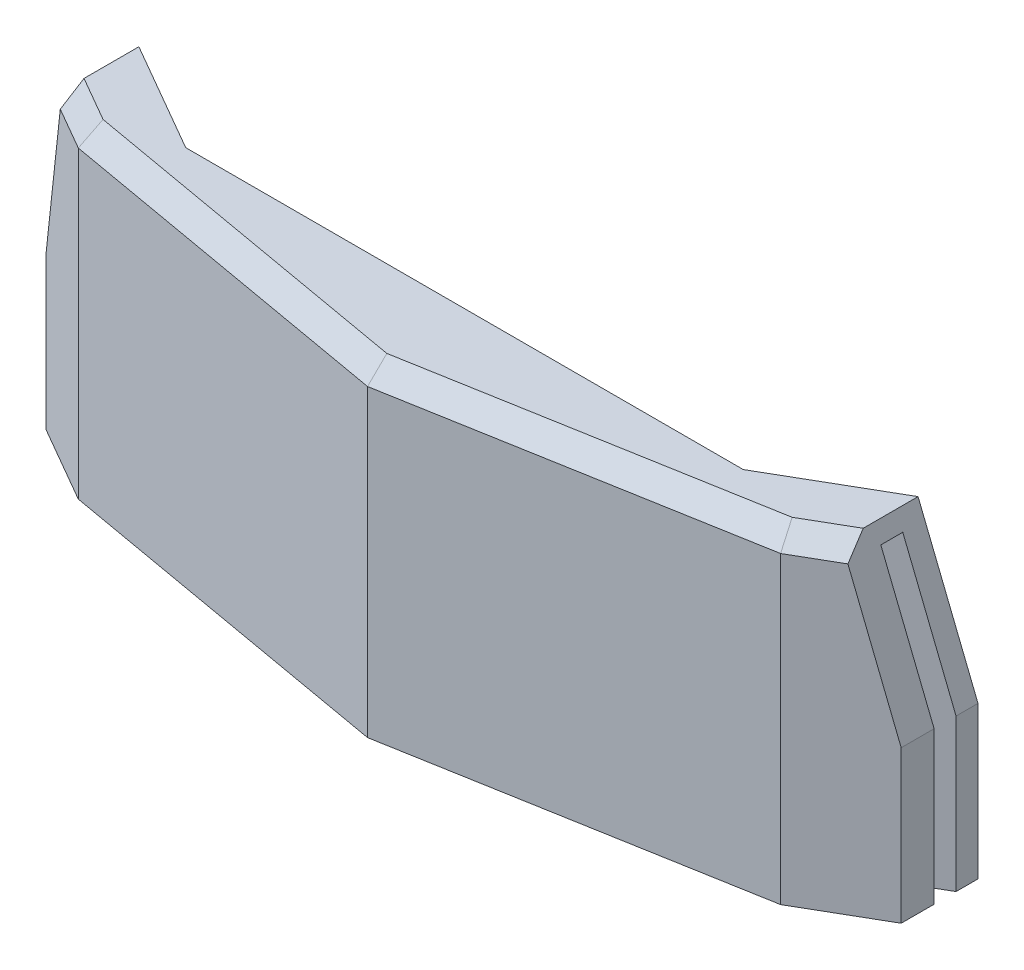
ISO-10303-21;
HEADER;
FILE_DESCRIPTION(('STEP AP214'),'2;1');
FILE_NAME('part.step','',(''),(''),'','','');
FILE_SCHEMA(('AUTOMOTIVE_DESIGN { 1 0 10303 214 1 1 1 1 }'));
ENDSEC;
DATA;
#1=APPLICATION_CONTEXT('core data for automotive mechanical design processes');
#2=APPLICATION_PROTOCOL_DEFINITION('international standard','automotive_design',2000,#1);
#3=PRODUCT_CONTEXT('',#1,'mechanical');
#4=PRODUCT('Part','Part','',(#3));
#5=PRODUCT_RELATED_PRODUCT_CATEGORY('part','',(#4));
#6=PRODUCT_DEFINITION_FORMATION('','',#4);
#7=PRODUCT_DEFINITION_CONTEXT('part definition',#1,'design');
#8=PRODUCT_DEFINITION('design','',#6,#7);
#9=PRODUCT_DEFINITION_SHAPE('','',#8);
#10=(LENGTH_UNIT() NAMED_UNIT(*) SI_UNIT(.MILLI.,.METRE.));
#11=(NAMED_UNIT(*) PLANE_ANGLE_UNIT() SI_UNIT($,.RADIAN.));
#12=(NAMED_UNIT(*) SI_UNIT($,.STERADIAN.) SOLID_ANGLE_UNIT());
#13=UNCERTAINTY_MEASURE_WITH_UNIT(LENGTH_MEASURE(1.E-05),#10,'distance_accuracy_value','');
#14=(GEOMETRIC_REPRESENTATION_CONTEXT(3) GLOBAL_UNCERTAINTY_ASSIGNED_CONTEXT((#13)) GLOBAL_UNIT_ASSIGNED_CONTEXT((#10,
#11,#12)) REPRESENTATION_CONTEXT('',''));
#15=CARTESIAN_POINT('',(0.,0.,0.));
#16=DIRECTION('',(0.,0.,1.));
#17=DIRECTION('',(1.,0.,0.));
#18=AXIS2_PLACEMENT_3D('',#15,#16,#17);
#19=CARTESIAN_POINT('',(-45.,34.,-16.1979697937081));
#20=DIRECTION('',(1.,0.,0.));
#21=DIRECTION('',(0.,0.,-1.));
#22=AXIS2_PLACEMENT_3D('',#19,#20,#21);
#23=PLANE('',#22);
#24=DIRECTION('',(0.,-1.,0.));
#25=VECTOR('',#24,1.);
#26=CARTESIAN_POINT('',(-45.,34.,-8.11506602505334));
#27=LINE('',#26,#25);
#28=CARTESIAN_POINT('',(-45.,16.,-8.11506602505334));
#29=VERTEX_POINT('',#28);
#30=CARTESIAN_POINT('',(-45.,0.,-8.11506602505334));
#31=VERTEX_POINT('',#30);
#32=EDGE_CURVE('E277',#29,#31,#27,.T.);
#33=ORIENTED_EDGE('',*,*,#32,.F.);
#34=DIRECTION('',(0.,0.,1.));
#35=VECTOR('',#34,1.);
#36=CARTESIAN_POINT('',(-45.,16.,-16.1979697937081));
#37=LINE('',#36,#35);
#38=CARTESIAN_POINT('',(-45.,16.,-11.5791676401911));
#39=VERTEX_POINT('',#38);
#40=EDGE_CURVE('E269',#39,#29,#37,.T.);
#41=ORIENTED_EDGE('',*,*,#40,.F.);
#42=DIRECTION('',(0.,-1.,0.));
#43=VECTOR('',#42,1.);
#44=CARTESIAN_POINT('',(-45.,32.,-11.5791676401911));
#45=LINE('',#44,#43);
#46=CARTESIAN_POINT('',(-45.,0.,-11.5791676401911));
#47=VERTEX_POINT('',#46);
#48=EDGE_CURVE('E499',#39,#47,#45,.T.);
#49=ORIENTED_EDGE('',*,*,#48,.T.);
#50=DIRECTION('',(0.,0.,1.));
#51=VECTOR('',#50,1.);
#52=CARTESIAN_POINT('',(-45.,0.,-16.1979697937081));
#53=LINE('',#52,#51);
#54=EDGE_CURVE('E450',#47,#31,#53,.T.);
#55=ORIENTED_EDGE('',*,*,#54,.T.);
#56=EDGE_LOOP('',(#33,#41,#49,#55));
#57=FACE_BOUND('',#56,.T.);
#58=ADVANCED_FACE('F47',(#57),#23,.F.);
#59=CARTESIAN_POINT('',(45.,34.,-16.1979697937081));
#60=DIRECTION('',(-1.,0.,0.));
#61=DIRECTION('',(0.,0.,1.));
#62=AXIS2_PLACEMENT_3D('',#59,#60,#61);
#63=PLANE('',#62);
#64=DIRECTION('',(0.,-1.,0.));
#65=VECTOR('',#64,1.);
#66=CARTESIAN_POINT('',(45.,34.,-16.1979697937081));
#67=LINE('',#66,#65);
#68=CARTESIAN_POINT('',(45.,16.,-16.1979697937081));
#69=VERTEX_POINT('',#68);
#70=CARTESIAN_POINT('',(45.,0.,-16.1979697937081));
#71=VERTEX_POINT('',#70);
#72=EDGE_CURVE('E378',#69,#71,#67,.T.);
#73=ORIENTED_EDGE('',*,*,#72,.F.);
#74=DIRECTION('',(0.,0.,1.));
#75=VECTOR('',#74,1.);
#76=CARTESIAN_POINT('',(45.,16.,-16.1979697937081));
#77=LINE('',#76,#75);
#78=CARTESIAN_POINT('',(45.,16.,-13.8885687169496));
#79=VERTEX_POINT('',#78);
#80=EDGE_CURVE('E599',#69,#79,#77,.T.);
#81=ORIENTED_EDGE('',*,*,#80,.T.);
#82=DIRECTION('',(0.,-1.,0.));
#83=VECTOR('',#82,1.);
#84=CARTESIAN_POINT('',(45.,32.,-13.8885687169496));
#85=LINE('',#84,#83);
#86=CARTESIAN_POINT('',(45.,0.,-13.8885687169496));
#87=VERTEX_POINT('',#86);
#88=EDGE_CURVE('E483',#79,#87,#85,.T.);
#89=ORIENTED_EDGE('',*,*,#88,.T.);
#90=DIRECTION('',(0.,0.,-1.));
#91=VECTOR('',#90,1.);
#92=CARTESIAN_POINT('',(45.,0.,-16.1979697937081));
#93=LINE('',#92,#91);
#94=EDGE_CURVE('E436',#87,#71,#93,.T.);
#95=ORIENTED_EDGE('',*,*,#94,.T.);
#96=EDGE_LOOP('',(#73,#81,#89,#95));
#97=FACE_BOUND('',#96,.T.);
#98=ADVANCED_FACE('F629',(#97),#63,.F.);
#99=CARTESIAN_POINT('',(-45.,34.,-16.1979697937081));
#100=DIRECTION('',(-0.5,0.,0.866025403784439));
#101=DIRECTION('',(0.866025403784439,0.,0.5));
#102=AXIS2_PLACEMENT_3D('',#99,#100,#101);
#103=PLANE('',#102);
#104=DIRECTION('',(0.,-1.,0.));
#105=VECTOR('',#104,1.);
#106=CARTESIAN_POINT('',(-45.,34.,-16.1979697937081));
#107=LINE('',#106,#105);
#108=CARTESIAN_POINT('',(-45.,16.,-16.1979697937081));
#109=VERTEX_POINT('',#108);
#110=CARTESIAN_POINT('',(-45.,0.,-16.1979697937081));
#111=VERTEX_POINT('',#110);
#112=EDGE_CURVE('E264',#109,#111,#107,.T.);
#113=ORIENTED_EDGE('',*,*,#112,.F.);
#114=DIRECTION('',(0.215248801014379,0.968619604496951,0.124273953208396));
#115=VECTOR('',#114,1.);
#116=CARTESIAN_POINT('',(-41.2471042468742,32.8880308878849,-14.0312344204003));
#117=LINE('',#116,#115);
#118=CARTESIAN_POINT('',(-40.9999999997202,34.,-13.888568716788));
#119=VERTEX_POINT('',#118);
#120=EDGE_CURVE('E246',#109,#119,#117,.T.);
#121=ORIENTED_EDGE('',*,*,#120,.T.);
#122=DIRECTION('',(-0.866025403784439,0.,-0.5));
#123=VECTOR('',#122,1.);
#124=CARTESIAN_POINT('',(-45.,34.,-16.1979697937081));
#125=LINE('',#124,#123);
#126=CARTESIAN_POINT('',(-29.3397459621556,34.,-7.1565179093807));
#127=VERTEX_POINT('',#126);
#128=EDGE_CURVE('E407',#127,#119,#125,.T.);
#129=ORIENTED_EDGE('',*,*,#128,.F.);
#130=DIRECTION('',(0.,1.,0.));
#131=VECTOR('',#130,1.);
#132=CARTESIAN_POINT('',(-29.3397459621556,32.,-7.1565179093807));
#133=LINE('',#132,#131);
#134=CARTESIAN_POINT('',(-29.3397459621556,32.,-7.1565179093807));
#135=VERTEX_POINT('',#134);
#136=EDGE_CURVE('E487',#135,#127,#133,.T.);
#137=ORIENTED_EDGE('',*,*,#136,.F.);
#138=DIRECTION('',(-0.866025403784439,0.,-0.5));
#139=VECTOR('',#138,1.);
#140=CARTESIAN_POINT('',(-38.,32.,-12.1565179093807));
#141=LINE('',#140,#139);
#142=CARTESIAN_POINT('',(-38.,32.,-12.1565179093807));
#143=VERTEX_POINT('',#142);
#144=EDGE_CURVE('E538',#135,#143,#141,.T.);
#145=ORIENTED_EDGE('',*,*,#144,.T.);
#146=DIRECTION('',(0.,-1.,0.));
#147=VECTOR('',#146,1.);
#148=CARTESIAN_POINT('',(-38.,34.,-12.1565179093807));
#149=LINE('',#148,#147);
#150=CARTESIAN_POINT('',(-38.,0.,-12.1565179093807));
#151=VERTEX_POINT('',#150);
#152=EDGE_CURVE('E399',#143,#151,#149,.T.);
#153=ORIENTED_EDGE('',*,*,#152,.T.);
#154=DIRECTION('',(-0.866025403784439,0.,-0.5));
#155=VECTOR('',#154,1.);
#156=CARTESIAN_POINT('',(-45.,0.,-16.1979697937081));
#157=LINE('',#156,#155);
#158=EDGE_CURVE('E274',#151,#111,#157,.T.);
#159=ORIENTED_EDGE('',*,*,#158,.T.);
#160=EDGE_LOOP('',(#113,#121,#129,#137,#145,#153,#159));
#161=FACE_BOUND('',#160,.T.);
#162=ADVANCED_FACE('F272',(#161),#103,.F.);
#163=DIRECTION('',(0.,-1.,0.));
#164=VECTOR('',#163,1.);
#165=CARTESIAN_POINT('',(-45.,32.,-13.8885687169496));
#166=LINE('',#165,#164);
#167=CARTESIAN_POINT('',(-45.,16.,-13.8885687169496));
#168=VERTEX_POINT('',#167);
#169=CARTESIAN_POINT('',(-45.,0.,-13.8885687169496));
#170=VERTEX_POINT('',#169);
#171=EDGE_CURVE('E266',#168,#170,#166,.T.);
#172=ORIENTED_EDGE('',*,*,#171,.F.);
#173=EDGE_CURVE('E249',#109,#168,#37,.T.);
#174=ORIENTED_EDGE('',*,*,#173,.F.);
#175=ORIENTED_EDGE('',*,*,#112,.T.);
#176=EDGE_CURVE('E447',#111,#170,#53,.T.);
#177=ORIENTED_EDGE('',*,*,#176,.T.);
#178=EDGE_LOOP('',(#172,#174,#175,#177));
#179=FACE_BOUND('',#178,.T.);
#180=ADVANCED_FACE('F262',(#179),#23,.F.);
#181=CARTESIAN_POINT('',(-36.9540041151969,34.,-3.46970813506362));
#182=DIRECTION('',(0.5,0.,-0.866025403784439));
#183=DIRECTION('',(-0.866025403784439,0.,-0.5));
#184=AXIS2_PLACEMENT_3D('',#181,#182,#183);
#185=PLANE('',#184);
#186=DIRECTION('',(-0.866025403784439,0.,-0.5));
#187=VECTOR('',#186,1.);
#188=CARTESIAN_POINT('',(-36.9540041151969,32.,-3.46970813506362));
#189=LINE('',#188,#187);
#190=CARTESIAN_POINT('',(-36.9540041151969,32.,-3.46970813506362));
#191=VERTEX_POINT('',#190);
#192=CARTESIAN_POINT('',(-41.4444444441957,32.,-6.06226506779108));
#193=VERTEX_POINT('',#192);
#194=EDGE_CURVE('E299',#191,#193,#189,.T.);
#195=ORIENTED_EDGE('',*,*,#194,.T.);
#196=DIRECTION('',(-0.215248801014379,-0.968619604496951,-0.124273953208396));
#197=VECTOR('',#196,1.);
#198=CARTESIAN_POINT('',(-40.7500543079794,35.124755612755,-5.66135873572395));
#199=LINE('',#198,#197);
#200=EDGE_CURVE('E63',#193,#29,#199,.T.);
#201=ORIENTED_EDGE('',*,*,#200,.T.);
#202=ORIENTED_EDGE('',*,*,#32,.T.);
#203=DIRECTION('',(0.866025403784439,0.,0.5));
#204=VECTOR('',#203,1.);
#205=CARTESIAN_POINT('',(-36.9540041151969,0.,-3.46970813506362));
#206=LINE('',#205,#204);
#207=CARTESIAN_POINT('',(-36.9540041151969,0.,-3.46970813506362));
#208=VERTEX_POINT('',#207);
#209=EDGE_CURVE('E371',#31,#208,#206,.T.);
#210=ORIENTED_EDGE('',*,*,#209,.T.);
#211=DIRECTION('',(0.,-1.,0.));
#212=VECTOR('',#211,1.);
#213=CARTESIAN_POINT('',(-36.9540041151969,34.,-3.46970813506362));
#214=LINE('',#213,#212);
#215=EDGE_CURVE('E283',#191,#208,#214,.T.);
#216=ORIENTED_EDGE('',*,*,#215,.F.);
#217=EDGE_LOOP('',(#195,#201,#202,#210,#216));
#218=FACE_BOUND('',#217,.T.);
#219=ADVANCED_FACE('F367',(#218),#185,.F.);
#220=CARTESIAN_POINT('',(0.,34.,3.04627983565723));
#221=DIRECTION('',(0.17364817766693,0.,-0.984807753012208));
#222=DIRECTION('',(-0.984807753012208,0.,-0.17364817766693));
#223=AXIS2_PLACEMENT_3D('',#220,#221,#222);
#224=PLANE('',#223);
#225=DIRECTION('',(0.,-1.,0.));
#226=VECTOR('',#225,1.);
#227=CARTESIAN_POINT('',(0.,34.,3.04627983565723));
#228=LINE('',#227,#226);
#229=CARTESIAN_POINT('',(0.,32.,3.04627983565723));
#230=VERTEX_POINT('',#229);
#231=CARTESIAN_POINT('',(0.,0.,3.04627983565723));
#232=VERTEX_POINT('',#231);
#233=EDGE_CURVE('E347',#230,#232,#228,.T.);
#234=ORIENTED_EDGE('',*,*,#233,.F.);
#235=DIRECTION('',(-0.984807753012208,0.,-0.17364817766693));
#236=VECTOR('',#235,1.);
#237=CARTESIAN_POINT('',(0.,32.,3.04627983565723));
#238=LINE('',#237,#236);
#239=EDGE_CURVE('E303',#230,#191,#238,.T.);
#240=ORIENTED_EDGE('',*,*,#239,.T.);
#241=ORIENTED_EDGE('',*,*,#215,.T.);
#242=DIRECTION('',(0.984807753012208,0.,0.17364817766693));
#243=VECTOR('',#242,1.);
#244=CARTESIAN_POINT('',(0.,0.,3.04627983565723));
#245=LINE('',#244,#243);
#246=EDGE_CURVE('E355',#208,#232,#245,.T.);
#247=ORIENTED_EDGE('',*,*,#246,.T.);
#248=EDGE_LOOP('',(#234,#240,#241,#247));
#249=FACE_BOUND('',#248,.T.);
#250=ADVANCED_FACE('F352',(#249),#224,.F.);
#251=CARTESIAN_POINT('',(36.9540041151968,34.,-3.46970813506364));
#252=DIRECTION('',(-0.173648177666931,0.,-0.984807753012208));
#253=DIRECTION('',(-0.984807753012208,0.,0.173648177666931));
#254=AXIS2_PLACEMENT_3D('',#251,#252,#253);
#255=PLANE('',#254);
#256=DIRECTION('',(0.,-1.,0.));
#257=VECTOR('',#256,1.);
#258=CARTESIAN_POINT('',(36.9540041151968,34.,-3.46970813506364));
#259=LINE('',#258,#257);
#260=CARTESIAN_POINT('',(36.9540041151968,32.,-3.46970813506364));
#261=VERTEX_POINT('',#260);
#262=CARTESIAN_POINT('',(36.9540041151968,0.,-3.46970813506364));
#263=VERTEX_POINT('',#262);
#264=EDGE_CURVE('E349',#261,#263,#259,.T.);
#265=ORIENTED_EDGE('',*,*,#264,.F.);
#266=DIRECTION('',(-0.984807753012208,0.,0.173648177666931));
#267=VECTOR('',#266,1.);
#268=CARTESIAN_POINT('',(36.9540041151968,32.,-3.46970813506364));
#269=LINE('',#268,#267);
#270=EDGE_CURVE('E306',#261,#230,#269,.T.);
#271=ORIENTED_EDGE('',*,*,#270,.T.);
#272=ORIENTED_EDGE('',*,*,#233,.T.);
#273=DIRECTION('',(0.984807753012208,0.,-0.173648177666931));
#274=VECTOR('',#273,1.);
#275=CARTESIAN_POINT('',(36.9540041151968,0.,-3.46970813506364));
#276=LINE('',#275,#274);
#277=EDGE_CURVE('E440',#232,#263,#276,.T.);
#278=ORIENTED_EDGE('',*,*,#277,.T.);
#279=EDGE_LOOP('',(#265,#271,#272,#278));
#280=FACE_BOUND('',#279,.T.);
#281=ADVANCED_FACE('F345',(#280),#255,.F.);
#282=CARTESIAN_POINT('',(36.9540041151968,34.,-3.46970813506364));
#283=DIRECTION('',(-0.5,0.,-0.866025403784439));
#284=DIRECTION('',(-0.866025403784439,0.,0.5));
#285=AXIS2_PLACEMENT_3D('',#282,#283,#284);
#286=PLANE('',#285);
#287=DIRECTION('',(0.,-1.,0.));
#288=VECTOR('',#287,1.);
#289=CARTESIAN_POINT('',(45.,34.,-8.11506602505336));
#290=LINE('',#289,#288);
#291=CARTESIAN_POINT('',(45.,16.,-8.11506602505336));
#292=VERTEX_POINT('',#291);
#293=CARTESIAN_POINT('',(45.,0.,-8.11506602505336));
#294=VERTEX_POINT('',#293);
#295=EDGE_CURVE('E332',#292,#294,#290,.T.);
#296=ORIENTED_EDGE('',*,*,#295,.F.);
#297=DIRECTION('',(-0.215248801014379,0.968619604496951,0.124273953208396));
#298=VECTOR('',#297,1.);
#299=CARTESIAN_POINT('',(40.7500543079794,35.124755612755,-5.66135873572396));
#300=LINE('',#299,#298);
#301=CARTESIAN_POINT('',(41.4444444441957,32.,-6.06226506779108));
#302=VERTEX_POINT('',#301);
#303=EDGE_CURVE('E268',#292,#302,#300,.T.);
#304=ORIENTED_EDGE('',*,*,#303,.T.);
#305=DIRECTION('',(-0.866025403784439,0.,0.5));
#306=VECTOR('',#305,1.);
#307=CARTESIAN_POINT('',(36.9540041151968,32.,-3.46970813506364));
#308=LINE('',#307,#306);
#309=EDGE_CURVE('E296',#302,#261,#308,.T.);
#310=ORIENTED_EDGE('',*,*,#309,.T.);
#311=ORIENTED_EDGE('',*,*,#264,.T.);
#312=DIRECTION('',(0.866025403784439,0.,-0.5));
#313=VECTOR('',#312,1.);
#314=CARTESIAN_POINT('',(36.9540041151968,0.,-3.46970813506364));
#315=LINE('',#314,#313);
#316=EDGE_CURVE('E437',#263,#294,#315,.T.);
#317=ORIENTED_EDGE('',*,*,#316,.T.);
#318=EDGE_LOOP('',(#296,#304,#310,#311,#317));
#319=FACE_BOUND('',#318,.T.);
#320=ADVANCED_FACE('F329',(#319),#286,.F.);
#321=DIRECTION('',(0.,-1.,0.));
#322=VECTOR('',#321,1.);
#323=CARTESIAN_POINT('',(45.,32.,-11.5791676401911));
#324=LINE('',#323,#322);
#325=CARTESIAN_POINT('',(45.,16.,-11.5791676401911));
#326=VERTEX_POINT('',#325);
#327=CARTESIAN_POINT('',(45.,0.,-11.5791676401911));
#328=VERTEX_POINT('',#327);
#329=EDGE_CURVE('E470',#326,#328,#324,.T.);
#330=ORIENTED_EDGE('',*,*,#329,.F.);
#331=EDGE_CURVE('E603',#326,#292,#77,.T.);
#332=ORIENTED_EDGE('',*,*,#331,.T.);
#333=ORIENTED_EDGE('',*,*,#295,.T.);
#334=EDGE_CURVE('E432',#294,#328,#93,.T.);
#335=ORIENTED_EDGE('',*,*,#334,.T.);
#336=EDGE_LOOP('',(#330,#332,#333,#335));
#337=FACE_BOUND('',#336,.T.);
#338=ADVANCED_FACE('F685',(#337),#63,.F.);
#339=CARTESIAN_POINT('',(38.,34.,-12.1565179093807));
#340=DIRECTION('',(0.500000000000001,0.,0.866025403784438));
#341=DIRECTION('',(0.866025403784438,0.,-0.500000000000001));
#342=AXIS2_PLACEMENT_3D('',#339,#340,#341);
#343=PLANE('',#342);
#344=DIRECTION('',(-0.866025403784438,0.,0.500000000000001));
#345=VECTOR('',#344,1.);
#346=CARTESIAN_POINT('',(38.,34.,-12.1565179093807));
#347=LINE('',#346,#345);
#348=CARTESIAN_POINT('',(40.9999999997202,34.,-13.8885687167881));
#349=VERTEX_POINT('',#348);
#350=CARTESIAN_POINT('',(29.3397459621556,34.,-7.15651790938072));
#351=VERTEX_POINT('',#350);
#352=EDGE_CURVE('E402',#349,#351,#347,.T.);
#353=ORIENTED_EDGE('',*,*,#352,.F.);
#354=DIRECTION('',(0.215248801014379,-0.968619604496951,-0.124273953208397));
#355=VECTOR('',#354,1.);
#356=CARTESIAN_POINT('',(40.814671814385,34.8339768339502,-13.7815694390963));
#357=LINE('',#356,#355);
#358=EDGE_CURVE('E584',#349,#69,#357,.T.);
#359=ORIENTED_EDGE('',*,*,#358,.T.);
#360=ORIENTED_EDGE('',*,*,#72,.T.);
#361=DIRECTION('',(-0.866025403784438,0.,0.500000000000001));
#362=VECTOR('',#361,1.);
#363=CARTESIAN_POINT('',(38.,0.,-12.1565179093807));
#364=LINE('',#363,#362);
#365=CARTESIAN_POINT('',(38.,0.,-12.1565179093807));
#366=VERTEX_POINT('',#365);
#367=EDGE_CURVE('E428',#71,#366,#364,.T.);
#368=ORIENTED_EDGE('',*,*,#367,.T.);
#369=DIRECTION('',(0.,-1.,0.));
#370=VECTOR('',#369,1.);
#371=CARTESIAN_POINT('',(38.,34.,-12.1565179093807));
#372=LINE('',#371,#370);
#373=CARTESIAN_POINT('',(38.,32.,-12.1565179093807));
#374=VERTEX_POINT('',#373);
#375=EDGE_CURVE('E381',#374,#366,#372,.T.);
#376=ORIENTED_EDGE('',*,*,#375,.F.);
#377=DIRECTION('',(-0.866025403784439,0.,0.5));
#378=VECTOR('',#377,1.);
#379=CARTESIAN_POINT('',(38.,32.,-12.1565179093807));
#380=LINE('',#379,#378);
#381=CARTESIAN_POINT('',(29.3397459621556,32.,-7.15651790938072));
#382=VERTEX_POINT('',#381);
#383=EDGE_CURVE('E542',#374,#382,#380,.T.);
#384=ORIENTED_EDGE('',*,*,#383,.T.);
#385=DIRECTION('',(0.,1.,0.));
#386=VECTOR('',#385,1.);
#387=CARTESIAN_POINT('',(29.3397459621556,32.,-7.15651790938072));
#388=LINE('',#387,#386);
#389=EDGE_CURVE('E527',#382,#351,#388,.T.);
#390=ORIENTED_EDGE('',*,*,#389,.T.);
#391=EDGE_LOOP('',(#353,#359,#360,#368,#376,#384,#390));
#392=FACE_BOUND('',#391,.T.);
#393=ADVANCED_FACE('F637',(#392),#343,.F.);
#394=CARTESIAN_POINT('',(38.,34.,-7.53771575586371));
#395=DIRECTION('',(1.,0.,0.));
#396=DIRECTION('',(0.,0.,-1.));
#397=AXIS2_PLACEMENT_3D('',#394,#395,#396);
#398=PLANE('',#397);
#399=DIRECTION('',(0.,-1.,0.));
#400=VECTOR('',#399,1.);
#401=CARTESIAN_POINT('',(38.,34.,-7.53771575586371));
#402=LINE('',#401,#400);
#403=CARTESIAN_POINT('',(38.,32.,-7.53771575586371));
#404=VERTEX_POINT('',#403);
#405=CARTESIAN_POINT('',(38.,0.,-7.53771575586371));
#406=VERTEX_POINT('',#405);
#407=EDGE_CURVE('E384',#404,#406,#402,.T.);
#408=ORIENTED_EDGE('',*,*,#407,.F.);
#409=DIRECTION('',(0.,0.,-1.));
#410=VECTOR('',#409,1.);
#411=CARTESIAN_POINT('',(38.,32.,-12.1565179093807));
#412=LINE('',#411,#410);
#413=EDGE_CURVE('E546',#404,#374,#412,.T.);
#414=ORIENTED_EDGE('',*,*,#413,.T.);
#415=ORIENTED_EDGE('',*,*,#375,.T.);
#416=DIRECTION('',(0.,0.,1.));
#417=VECTOR('',#416,1.);
#418=CARTESIAN_POINT('',(38.,0.,-7.53771575586371));
#419=LINE('',#418,#417);
#420=EDGE_CURVE('E424',#366,#406,#419,.T.);
#421=ORIENTED_EDGE('',*,*,#420,.T.);
#422=EDGE_LOOP('',(#408,#414,#415,#421));
#423=FACE_BOUND('',#422,.T.);
#424=ADVANCED_FACE('F849',(#423),#398,.F.);
#425=CARTESIAN_POINT('',(35.9121150491953,34.,-6.33227481747966));
#426=DIRECTION('',(0.5,0.,0.866025403784439));
#427=DIRECTION('',(0.866025403784439,0.,-0.5));
#428=AXIS2_PLACEMENT_3D('',#425,#426,#427);
#429=PLANE('',#428);
#430=DIRECTION('',(0.,-1.,0.));
#431=VECTOR('',#430,1.);
#432=CARTESIAN_POINT('',(35.9121150491953,34.,-6.33227481747966));
#433=LINE('',#432,#431);
#434=CARTESIAN_POINT('',(35.9121150491953,32.,-6.33227481747966));
#435=VERTEX_POINT('',#434);
#436=CARTESIAN_POINT('',(35.9121150491953,0.,-6.33227481747966));
#437=VERTEX_POINT('',#436);
#438=EDGE_CURVE('E387',#435,#437,#433,.T.);
#439=ORIENTED_EDGE('',*,*,#438,.F.);
#440=DIRECTION('',(0.866025403784439,0.,-0.5));
#441=VECTOR('',#440,1.);
#442=CARTESIAN_POINT('',(38.,32.,-7.53771575586371));
#443=LINE('',#442,#441);
#444=EDGE_CURVE('E550',#435,#404,#443,.T.);
#445=ORIENTED_EDGE('',*,*,#444,.T.);
#446=ORIENTED_EDGE('',*,*,#407,.T.);
#447=DIRECTION('',(-0.866025403784439,0.,0.5));
#448=VECTOR('',#447,1.);
#449=CARTESIAN_POINT('',(35.9121150491953,0.,-6.33227481747966));
#450=LINE('',#449,#448);
#451=EDGE_CURVE('E420',#406,#437,#450,.T.);
#452=ORIENTED_EDGE('',*,*,#451,.T.);
#453=EDGE_LOOP('',(#439,#445,#446,#452));
#454=FACE_BOUND('',#453,.T.);
#455=ADVANCED_FACE('F989',(#454),#429,.F.);
#456=CARTESIAN_POINT('',(0.,34.,0.));
#457=DIRECTION('',(0.173648177666931,0.,0.984807753012208));
#458=DIRECTION('',(0.984807753012208,0.,-0.173648177666931));
#459=AXIS2_PLACEMENT_3D('',#456,#457,#458);
#460=PLANE('',#459);
#461=DIRECTION('',(0.,-1.,0.));
#462=VECTOR('',#461,1.);
#463=CARTESIAN_POINT('',(0.,34.,0.));
#464=LINE('',#463,#462);
#465=CARTESIAN_POINT('',(0.,32.,0.));
#466=VERTEX_POINT('',#465);
#467=CARTESIAN_POINT('',(0.,0.,0.));
#468=VERTEX_POINT('',#467);
#469=EDGE_CURVE('E390',#466,#468,#464,.T.);
#470=ORIENTED_EDGE('',*,*,#469,.F.);
#471=DIRECTION('',(0.984807753012208,0.,-0.173648177666931));
#472=VECTOR('',#471,1.);
#473=CARTESIAN_POINT('',(35.9121150491953,32.,-6.33227481747966));
#474=LINE('',#473,#472);
#475=EDGE_CURVE('E554',#466,#435,#474,.T.);
#476=ORIENTED_EDGE('',*,*,#475,.T.);
#477=ORIENTED_EDGE('',*,*,#438,.T.);
#478=DIRECTION('',(-0.984807753012208,0.,0.173648177666931));
#479=VECTOR('',#478,1.);
#480=CARTESIAN_POINT('',(0.,0.,0.));
#481=LINE('',#480,#479);
#482=EDGE_CURVE('E416',#437,#468,#481,.T.);
#483=ORIENTED_EDGE('',*,*,#482,.T.);
#484=EDGE_LOOP('',(#470,#476,#477,#483));
#485=FACE_BOUND('',#484,.T.);
#486=ADVANCED_FACE('F979',(#485),#460,.F.);
#487=CARTESIAN_POINT('',(-35.9121150491953,34.,-6.33227481747963));
#488=DIRECTION('',(-0.17364817766693,0.,0.984807753012208));
#489=DIRECTION('',(0.984807753012208,0.,0.17364817766693));
#490=AXIS2_PLACEMENT_3D('',#487,#488,#489);
#491=PLANE('',#490);
#492=DIRECTION('',(0.,-1.,0.));
#493=VECTOR('',#492,1.);
#494=CARTESIAN_POINT('',(-35.9121150491953,34.,-6.33227481747963));
#495=LINE('',#494,#493);
#496=CARTESIAN_POINT('',(-35.9121150491953,32.,-6.33227481747963));
#497=VERTEX_POINT('',#496);
#498=CARTESIAN_POINT('',(-35.9121150491953,0.,-6.33227481747963));
#499=VERTEX_POINT('',#498);
#500=EDGE_CURVE('E393',#497,#499,#495,.T.);
#501=ORIENTED_EDGE('',*,*,#500,.F.);
#502=DIRECTION('',(0.984807753012208,0.,0.17364817766693));
#503=VECTOR('',#502,1.);
#504=CARTESIAN_POINT('',(0.,32.,0.));
#505=LINE('',#504,#503);
#506=EDGE_CURVE('E558',#497,#466,#505,.T.);
#507=ORIENTED_EDGE('',*,*,#506,.T.);
#508=ORIENTED_EDGE('',*,*,#469,.T.);
#509=DIRECTION('',(-0.984807753012208,0.,-0.17364817766693));
#510=VECTOR('',#509,1.);
#511=CARTESIAN_POINT('',(-35.9121150491953,0.,-6.33227481747963));
#512=LINE('',#511,#510);
#513=EDGE_CURVE('E412',#468,#499,#512,.T.);
#514=ORIENTED_EDGE('',*,*,#513,.T.);
#515=EDGE_LOOP('',(#501,#507,#508,#514));
#516=FACE_BOUND('',#515,.T.);
#517=ADVANCED_FACE('F970',(#516),#491,.F.);
#518=CARTESIAN_POINT('',(-38.,34.,-7.53771575586371));
#519=DIRECTION('',(-0.5,0.,0.866025403784439));
#520=DIRECTION('',(0.866025403784439,0.,0.5));
#521=AXIS2_PLACEMENT_3D('',#518,#519,#520);
#522=PLANE('',#521);
#523=DIRECTION('',(0.,-1.,0.));
#524=VECTOR('',#523,1.);
#525=CARTESIAN_POINT('',(-38.,34.,-7.53771575586371));
#526=LINE('',#525,#524);
#527=CARTESIAN_POINT('',(-38.,32.,-7.53771575586371));
#528=VERTEX_POINT('',#527);
#529=CARTESIAN_POINT('',(-38.,0.,-7.53771575586371));
#530=VERTEX_POINT('',#529);
#531=EDGE_CURVE('E396',#528,#530,#526,.T.);
#532=ORIENTED_EDGE('',*,*,#531,.F.);
#533=DIRECTION('',(0.866025403784439,0.,0.5));
#534=VECTOR('',#533,1.);
#535=CARTESIAN_POINT('',(-35.9121150491953,32.,-6.33227481747963));
#536=LINE('',#535,#534);
#537=EDGE_CURVE('E562',#528,#497,#536,.T.);
#538=ORIENTED_EDGE('',*,*,#537,.T.);
#539=ORIENTED_EDGE('',*,*,#500,.T.);
#540=DIRECTION('',(-0.866025403784439,0.,-0.5));
#541=VECTOR('',#540,1.);
#542=CARTESIAN_POINT('',(-38.,0.,-7.53771575586371));
#543=LINE('',#542,#541);
#544=EDGE_CURVE('E408',#499,#530,#543,.T.);
#545=ORIENTED_EDGE('',*,*,#544,.T.);
#546=EDGE_LOOP('',(#532,#538,#539,#545));
#547=FACE_BOUND('',#546,.T.);
#548=ADVANCED_FACE('F651',(#547),#522,.F.);
#549=CARTESIAN_POINT('',(-38.,34.,-12.1565179093807));
#550=DIRECTION('',(-1.,0.,0.));
#551=DIRECTION('',(0.,0.,1.));
#552=AXIS2_PLACEMENT_3D('',#549,#550,#551);
#553=PLANE('',#552);
#554=ORIENTED_EDGE('',*,*,#152,.F.);
#555=DIRECTION('',(0.,0.,1.));
#556=VECTOR('',#555,1.);
#557=CARTESIAN_POINT('',(-38.,32.,-7.53771575586371));
#558=LINE('',#557,#556);
#559=EDGE_CURVE('E566',#143,#528,#558,.T.);
#560=ORIENTED_EDGE('',*,*,#559,.T.);
#561=ORIENTED_EDGE('',*,*,#531,.T.);
#562=DIRECTION('',(0.,0.,-1.));
#563=VECTOR('',#562,1.);
#564=CARTESIAN_POINT('',(-38.,0.,-12.1565179093807));
#565=LINE('',#564,#563);
#566=EDGE_CURVE('E403',#530,#151,#565,.T.);
#567=ORIENTED_EDGE('',*,*,#566,.T.);
#568=EDGE_LOOP('',(#554,#560,#561,#567));
#569=FACE_BOUND('',#568,.T.);
#570=ADVANCED_FACE('F649',(#569),#553,.F.);
#571=CARTESIAN_POINT('',(0.,34.,0.));
#572=DIRECTION('',(0.,-1.,0.));
#573=DIRECTION('',(0.,0.,-1.));
#574=AXIS2_PLACEMENT_3D('',#571,#572,#573);
#575=PLANE('',#574);
#576=ORIENTED_EDGE('',*,*,#128,.T.);
#577=DIRECTION('',(0.,0.,1.));
#578=VECTOR('',#577,1.);
#579=CARTESIAN_POINT('',(-40.9999999997202,34.,-16.1979697937081));
#580=LINE('',#579,#578);
#581=CARTESIAN_POINT('',(-40.9999999997202,34.,-8.1150660248918));
#582=VERTEX_POINT('',#581);
#583=EDGE_CURVE('E252',#119,#582,#580,.T.);
#584=ORIENTED_EDGE('',*,*,#583,.T.);
#585=DIRECTION('',(0.866025403784439,0.,0.5));
#586=VECTOR('',#585,1.);
#587=CARTESIAN_POINT('',(-6.7360733344579,34.,11.667221258791));
#588=LINE('',#587,#586);
#589=CARTESIAN_POINT('',(-36.2594114045291,34.,-5.37808592334095));
#590=VERTEX_POINT('',#589);
#591=EDGE_CURVE('E289',#582,#590,#588,.T.);
#592=ORIENTED_EDGE('',*,*,#591,.T.);
#593=DIRECTION('',(0.984807753012208,0.,0.17364817766693));
#594=VECTOR('',#593,1.);
#595=CARTESIAN_POINT('',(-0.17364817766693,34.,0.984807753012205));
#596=LINE('',#595,#594);
#597=CARTESIAN_POINT('',(0.,34.,1.01542661188575));
#598=VERTEX_POINT('',#597);
#599=EDGE_CURVE('E281',#590,#598,#596,.T.);
#600=ORIENTED_EDGE('',*,*,#599,.T.);
#601=DIRECTION('',(0.984807753012208,0.,-0.173648177666931));
#602=VECTOR('',#601,1.);
#603=CARTESIAN_POINT('',(0.173648177666932,34.,0.984807753012215));
#604=LINE('',#603,#602);
#605=CARTESIAN_POINT('',(36.2594114045291,34.,-5.37808592334098));
#606=VERTEX_POINT('',#605);
#607=EDGE_CURVE('E276',#598,#606,#604,.T.);
#608=ORIENTED_EDGE('',*,*,#607,.T.);
#609=DIRECTION('',(0.866025403784439,0.,-0.5));
#610=VECTOR('',#609,1.);
#611=CARTESIAN_POINT('',(6.73607333445789,34.,11.667221258791));
#612=LINE('',#611,#610);
#613=CARTESIAN_POINT('',(40.9999999997202,34.,-8.11506602489181));
#614=VERTEX_POINT('',#613);
#615=EDGE_CURVE('E292',#606,#614,#612,.T.);
#616=ORIENTED_EDGE('',*,*,#615,.T.);
#617=DIRECTION('',(0.,0.,1.));
#618=VECTOR('',#617,1.);
#619=CARTESIAN_POINT('',(40.9999999997202,34.,-16.1979697937081));
#620=LINE('',#619,#618);
#621=EDGE_CURVE('E71',#349,#614,#620,.T.);
#622=ORIENTED_EDGE('',*,*,#621,.F.);
#623=ORIENTED_EDGE('',*,*,#352,.T.);
#624=DIRECTION('',(-1.,0.,0.));
#625=VECTOR('',#624,1.);
#626=CARTESIAN_POINT('',(-29.3397459621556,34.,-7.1565179093807));
#627=LINE('',#626,#625);
#628=EDGE_CURVE('E319',#351,#127,#627,.T.);
#629=ORIENTED_EDGE('',*,*,#628,.T.);
#630=EDGE_LOOP('',(#576,#584,#592,#600,#608,#616,#622,#623,#629));
#631=FACE_BOUND('',#630,.T.);
#632=ADVANCED_FACE('F638',(#631),#575,.F.);
#633=CARTESIAN_POINT('',(0.,0.,0.));
#634=DIRECTION('',(0.,-1.,0.));
#635=DIRECTION('',(0.,0.,-1.));
#636=AXIS2_PLACEMENT_3D('',#633,#634,#635);
#637=PLANE('',#636);
#638=DIRECTION('',(0.866025403784439,0.,0.5));
#639=VECTOR('',#638,1.);
#640=CARTESIAN_POINT('',(-45.,0.,-13.8885687169496));
#641=LINE('',#640,#639);
#642=CARTESIAN_POINT('',(-40.,0.,-11.0018173710015));
#643=VERTEX_POINT('',#642);
#644=EDGE_CURVE('E507',#170,#643,#641,.T.);
#645=ORIENTED_EDGE('',*,*,#644,.F.);
#646=ORIENTED_EDGE('',*,*,#176,.F.);
#647=ORIENTED_EDGE('',*,*,#158,.F.);
#648=ORIENTED_EDGE('',*,*,#566,.F.);
#649=ORIENTED_EDGE('',*,*,#544,.F.);
#650=ORIENTED_EDGE('',*,*,#513,.F.);
#651=ORIENTED_EDGE('',*,*,#482,.F.);
#652=ORIENTED_EDGE('',*,*,#451,.F.);
#653=ORIENTED_EDGE('',*,*,#420,.F.);
#654=ORIENTED_EDGE('',*,*,#367,.F.);
#655=ORIENTED_EDGE('',*,*,#94,.F.);
#656=DIRECTION('',(0.866025403784439,0.,-0.5));
#657=VECTOR('',#656,1.);
#658=CARTESIAN_POINT('',(45.,0.,-13.8885687169496));
#659=LINE('',#658,#657);
#660=CARTESIAN_POINT('',(40.,0.,-11.0018173710015));
#661=VERTEX_POINT('',#660);
#662=EDGE_CURVE('E461',#661,#87,#659,.T.);
#663=ORIENTED_EDGE('',*,*,#662,.F.);
#664=DIRECTION('',(0.,0.,-1.));
#665=VECTOR('',#664,1.);
#666=CARTESIAN_POINT('',(40.,0.,-8.69241629424297));
#667=LINE('',#666,#665);
#668=CARTESIAN_POINT('',(40.,0.,-8.69241629424297));
#669=VERTEX_POINT('',#668);
#670=EDGE_CURVE('E476',#669,#661,#667,.T.);
#671=ORIENTED_EDGE('',*,*,#670,.F.);
#672=DIRECTION('',(-0.866025403784439,0.,0.5));
#673=VECTOR('',#672,1.);
#674=CARTESIAN_POINT('',(40.,0.,-8.69241629424297));
#675=LINE('',#674,#673);
#676=EDGE_CURVE('E471',#328,#669,#675,.T.);
#677=ORIENTED_EDGE('',*,*,#676,.F.);
#678=ORIENTED_EDGE('',*,*,#334,.F.);
#679=ORIENTED_EDGE('',*,*,#316,.F.);
#680=ORIENTED_EDGE('',*,*,#277,.F.);
#681=ORIENTED_EDGE('',*,*,#246,.F.);
#682=ORIENTED_EDGE('',*,*,#209,.F.);
#683=ORIENTED_EDGE('',*,*,#54,.F.);
#684=DIRECTION('',(-0.866025403784439,0.,-0.5));
#685=VECTOR('',#684,1.);
#686=CARTESIAN_POINT('',(-40.,0.,-8.69241629424296));
#687=LINE('',#686,#685);
#688=CARTESIAN_POINT('',(-40.,0.,-8.69241629424296));
#689=VERTEX_POINT('',#688);
#690=EDGE_CURVE('E512',#689,#47,#687,.T.);
#691=ORIENTED_EDGE('',*,*,#690,.F.);
#692=DIRECTION('',(0.,0.,1.));
#693=VECTOR('',#692,1.);
#694=CARTESIAN_POINT('',(-40.,0.,-11.0018173710015));
#695=LINE('',#694,#693);
#696=EDGE_CURVE('E475',#643,#689,#695,.T.);
#697=ORIENTED_EDGE('',*,*,#696,.F.);
#698=EDGE_LOOP('',(#645,#646,#647,#648,#649,#650,#651,#652,#653,#654,#655,#663,#671,#677,#678,
#679,#680,#681,#682,#683,#691,#697));
#699=FACE_BOUND('',#698,.T.);
#700=ADVANCED_FACE('F621',(#699),#637,.T.);
#701=CARTESIAN_POINT('',(45.,32.,-13.8885687169496));
#702=DIRECTION('',(-0.5,0.,-0.866025403784439));
#703=DIRECTION('',(-0.866025403784439,0.,0.5));
#704=AXIS2_PLACEMENT_3D('',#701,#702,#703);
#705=PLANE('',#704);
#706=ORIENTED_EDGE('',*,*,#88,.F.);
#707=DIRECTION('',(-0.215248801014379,0.968619604496951,0.124273953208396));
#708=VECTOR('',#707,1.);
#709=CARTESIAN_POINT('',(41.6640926638881,31.0115830114533,-11.9625817184538));
#710=LINE('',#709,#708);
#711=CARTESIAN_POINT('',(41.4444444441957,32.,-11.8357677596873));
#712=VERTEX_POINT('',#711);
#713=EDGE_CURVE('E588',#79,#712,#710,.T.);
#714=ORIENTED_EDGE('',*,*,#713,.T.);
#715=DIRECTION('',(0.866025403784439,0.,-0.5));
#716=VECTOR('',#715,1.);
#717=CARTESIAN_POINT('',(45.,32.,-13.8885687169496));
#718=LINE('',#717,#716);
#719=CARTESIAN_POINT('',(40.,32.,-11.0018173710015));
#720=VERTEX_POINT('',#719);
#721=EDGE_CURVE('E466',#720,#712,#718,.T.);
#722=ORIENTED_EDGE('',*,*,#721,.F.);
#723=DIRECTION('',(0.,-1.,0.));
#724=VECTOR('',#723,1.);
#725=CARTESIAN_POINT('',(40.,32.,-11.0018173710015));
#726=LINE('',#725,#724);
#727=EDGE_CURVE('E486',#720,#661,#726,.T.);
#728=ORIENTED_EDGE('',*,*,#727,.T.);
#729=ORIENTED_EDGE('',*,*,#662,.T.);
#730=EDGE_LOOP('',(#706,#714,#722,#728,#729));
#731=FACE_BOUND('',#730,.T.);
#732=ADVANCED_FACE('F921',(#731),#705,.F.);
#733=CARTESIAN_POINT('',(40.,32.,-8.69241629424297));
#734=DIRECTION('',(-1.,0.,0.));
#735=DIRECTION('',(0.,0.,1.));
#736=AXIS2_PLACEMENT_3D('',#733,#734,#735);
#737=PLANE('',#736);
#738=ORIENTED_EDGE('',*,*,#670,.T.);
#739=ORIENTED_EDGE('',*,*,#727,.F.);
#740=DIRECTION('',(0.,0.,-1.));
#741=VECTOR('',#740,1.);
#742=CARTESIAN_POINT('',(40.,32.,-8.69241629424297));
#743=LINE('',#742,#741);
#744=CARTESIAN_POINT('',(40.,32.,-8.69241629424297));
#745=VERTEX_POINT('',#744);
#746=EDGE_CURVE('E462',#745,#720,#743,.T.);
#747=ORIENTED_EDGE('',*,*,#746,.F.);
#748=DIRECTION('',(0.,-1.,0.));
#749=VECTOR('',#748,1.);
#750=CARTESIAN_POINT('',(40.,32.,-8.69241629424297));
#751=LINE('',#750,#749);
#752=EDGE_CURVE('E490',#745,#669,#751,.T.);
#753=ORIENTED_EDGE('',*,*,#752,.T.);
#754=EDGE_LOOP('',(#738,#739,#747,#753));
#755=FACE_BOUND('',#754,.T.);
#756=ADVANCED_FACE('F911',(#755),#737,.F.);
#757=CARTESIAN_POINT('',(40.,32.,-8.69241629424297));
#758=DIRECTION('',(0.5,0.,0.866025403784439));
#759=DIRECTION('',(0.866025403784439,0.,-0.5));
#760=AXIS2_PLACEMENT_3D('',#757,#758,#759);
#761=PLANE('',#760);
#762=DIRECTION('',(-0.866025403784439,0.,0.5));
#763=VECTOR('',#762,1.);
#764=CARTESIAN_POINT('',(40.,32.,-8.69241629424297));
#765=LINE('',#764,#763);
#766=CARTESIAN_POINT('',(41.4444444441957,32.,-9.52636668292883));
#767=VERTEX_POINT('',#766);
#768=EDGE_CURVE('E458',#767,#745,#765,.T.);
#769=ORIENTED_EDGE('',*,*,#768,.F.);
#770=DIRECTION('',(0.215248801014379,-0.968619604496951,-0.124273953208396));
#771=VECTOR('',#770,1.);
#772=CARTESIAN_POINT('',(41.3552123549673,32.4015444014999,-9.47484851219244));
#773=LINE('',#772,#771);
#774=EDGE_CURVE('E592',#767,#326,#773,.T.);
#775=ORIENTED_EDGE('',*,*,#774,.T.);
#776=ORIENTED_EDGE('',*,*,#329,.T.);
#777=ORIENTED_EDGE('',*,*,#676,.T.);
#778=ORIENTED_EDGE('',*,*,#752,.F.);
#779=EDGE_LOOP('',(#769,#775,#776,#777,#778));
#780=FACE_BOUND('',#779,.T.);
#781=ADVANCED_FACE('F674',(#780),#761,.F.);
#782=CARTESIAN_POINT('',(0.,32.,0.));
#783=DIRECTION('',(0.,1.,0.));
#784=DIRECTION('',(0.,0.,1.));
#785=AXIS2_PLACEMENT_3D('',#782,#783,#784);
#786=PLANE('',#785);
#787=ORIENTED_EDGE('',*,*,#721,.T.);
#788=DIRECTION('',(0.,0.,1.));
#789=VECTOR('',#788,1.);
#790=CARTESIAN_POINT('',(41.4444444441957,32.,0.));
#791=LINE('',#790,#789);
#792=EDGE_CURVE('E334',#712,#767,#791,.T.);
#793=ORIENTED_EDGE('',*,*,#792,.T.);
#794=ORIENTED_EDGE('',*,*,#768,.T.);
#795=ORIENTED_EDGE('',*,*,#746,.T.);
#796=EDGE_LOOP('',(#787,#793,#794,#795));
#797=FACE_BOUND('',#796,.T.);
#798=ADVANCED_FACE('F667',(#797),#786,.F.);
#799=CARTESIAN_POINT('',(-40.,32.,-11.0018173710015));
#800=DIRECTION('',(1.,0.,0.));
#801=DIRECTION('',(0.,0.,-1.));
#802=AXIS2_PLACEMENT_3D('',#799,#800,#801);
#803=PLANE('',#802);
#804=ORIENTED_EDGE('',*,*,#696,.T.);
#805=DIRECTION('',(0.,-1.,0.));
#806=VECTOR('',#805,1.);
#807=CARTESIAN_POINT('',(-40.,32.,-8.69241629424296));
#808=LINE('',#807,#806);
#809=CARTESIAN_POINT('',(-40.,32.,-8.69241629424296));
#810=VERTEX_POINT('',#809);
#811=EDGE_CURVE('E495',#810,#689,#808,.T.);
#812=ORIENTED_EDGE('',*,*,#811,.F.);
#813=DIRECTION('',(0.,0.,1.));
#814=VECTOR('',#813,1.);
#815=CARTESIAN_POINT('',(-40.,32.,-11.0018173710015));
#816=LINE('',#815,#814);
#817=CARTESIAN_POINT('',(-40.,32.,-11.0018173710015));
#818=VERTEX_POINT('',#817);
#819=EDGE_CURVE('E511',#818,#810,#816,.T.);
#820=ORIENTED_EDGE('',*,*,#819,.F.);
#821=DIRECTION('',(0.,-1.,0.));
#822=VECTOR('',#821,1.);
#823=CARTESIAN_POINT('',(-40.,32.,-11.0018173710015));
#824=LINE('',#823,#822);
#825=EDGE_CURVE('E453',#818,#643,#824,.T.);
#826=ORIENTED_EDGE('',*,*,#825,.T.);
#827=EDGE_LOOP('',(#804,#812,#820,#826));
#828=FACE_BOUND('',#827,.T.);
#829=ADVANCED_FACE('F665',(#828),#803,.F.);
#830=CARTESIAN_POINT('',(-45.,32.,-13.8885687169496));
#831=DIRECTION('',(0.5,0.,-0.866025403784439));
#832=DIRECTION('',(-0.866025403784439,0.,-0.5));
#833=AXIS2_PLACEMENT_3D('',#830,#831,#832);
#834=PLANE('',#833);
#835=DIRECTION('',(0.866025403784439,0.,0.5));
#836=VECTOR('',#835,1.);
#837=CARTESIAN_POINT('',(-45.,32.,-13.8885687169496));
#838=LINE('',#837,#836);
#839=CARTESIAN_POINT('',(-41.4444444441957,32.,-11.8357677596873));
#840=VERTEX_POINT('',#839);
#841=EDGE_CURVE('E500',#840,#818,#838,.T.);
#842=ORIENTED_EDGE('',*,*,#841,.F.);
#843=DIRECTION('',(-0.215248801014379,-0.968619604496951,-0.124273953208396));
#844=VECTOR('',#843,1.);
#845=CARTESIAN_POINT('',(-41.6640926638882,31.0115830114533,-11.9625817184538));
#846=LINE('',#845,#844);
#847=EDGE_CURVE('E258',#840,#168,#846,.T.);
#848=ORIENTED_EDGE('',*,*,#847,.T.);
#849=ORIENTED_EDGE('',*,*,#171,.T.);
#850=ORIENTED_EDGE('',*,*,#644,.T.);
#851=ORIENTED_EDGE('',*,*,#825,.F.);
#852=EDGE_LOOP('',(#842,#848,#849,#850,#851));
#853=FACE_BOUND('',#852,.T.);
#854=ADVANCED_FACE('F659',(#853),#834,.F.);
#855=CARTESIAN_POINT('',(-40.,32.,-8.69241629424296));
#856=DIRECTION('',(-0.5,0.,0.866025403784439));
#857=DIRECTION('',(0.866025403784439,0.,0.5));
#858=AXIS2_PLACEMENT_3D('',#855,#856,#857);
#859=PLANE('',#858);
#860=ORIENTED_EDGE('',*,*,#48,.F.);
#861=DIRECTION('',(0.215248801014379,0.968619604496951,0.124273953208396));
#862=VECTOR('',#861,1.);
#863=CARTESIAN_POINT('',(-41.3552123549673,32.4015444014999,-9.47484851219244));
#864=LINE('',#863,#862);
#865=CARTESIAN_POINT('',(-41.4444444441957,32.,-9.52636668292882));
#866=VERTEX_POINT('',#865);
#867=EDGE_CURVE('E575',#39,#866,#864,.T.);
#868=ORIENTED_EDGE('',*,*,#867,.T.);
#869=DIRECTION('',(-0.866025403784439,0.,-0.5));
#870=VECTOR('',#869,1.);
#871=CARTESIAN_POINT('',(-40.,32.,-8.69241629424296));
#872=LINE('',#871,#870);
#873=EDGE_CURVE('E520',#810,#866,#872,.T.);
#874=ORIENTED_EDGE('',*,*,#873,.F.);
#875=ORIENTED_EDGE('',*,*,#811,.T.);
#876=ORIENTED_EDGE('',*,*,#690,.T.);
#877=EDGE_LOOP('',(#860,#868,#874,#875,#876));
#878=FACE_BOUND('',#877,.T.);
#879=ADVANCED_FACE('F614',(#878),#859,.F.);
#880=CARTESIAN_POINT('',(0.,32.,0.));
#881=DIRECTION('',(0.,-1.,0.));
#882=DIRECTION('',(0.,0.,-1.));
#883=AXIS2_PLACEMENT_3D('',#880,#881,#882);
#884=PLANE('',#883);
#885=DIRECTION('',(0.,0.,1.));
#886=VECTOR('',#885,1.);
#887=CARTESIAN_POINT('',(-41.4444444441957,32.,0.));
#888=LINE('',#887,#886);
#889=EDGE_CURVE('E579',#840,#866,#888,.T.);
#890=ORIENTED_EDGE('',*,*,#889,.F.);
#891=ORIENTED_EDGE('',*,*,#841,.T.);
#892=ORIENTED_EDGE('',*,*,#819,.T.);
#893=ORIENTED_EDGE('',*,*,#873,.T.);
#894=EDGE_LOOP('',(#890,#891,#892,#893));
#895=FACE_BOUND('',#894,.T.);
#896=ADVANCED_FACE('F663',(#895),#884,.T.);
#897=CARTESIAN_POINT('',(-29.3397459621556,32.,-7.1565179093807));
#898=DIRECTION('',(0.,0.,-1.));
#899=DIRECTION('',(-1.,0.,0.));
#900=AXIS2_PLACEMENT_3D('',#897,#898,#899);
#901=PLANE('',#900);
#902=ORIENTED_EDGE('',*,*,#628,.F.);
#903=ORIENTED_EDGE('',*,*,#389,.F.);
#904=DIRECTION('',(-1.,0.,0.));
#905=VECTOR('',#904,1.);
#906=CARTESIAN_POINT('',(-29.3397459621556,32.,-7.1565179093807));
#907=LINE('',#906,#905);
#908=EDGE_CURVE('E531',#382,#135,#907,.T.);
#909=ORIENTED_EDGE('',*,*,#908,.T.);
#910=ORIENTED_EDGE('',*,*,#136,.T.);
#911=EDGE_LOOP('',(#902,#903,#909,#910));
#912=FACE_BOUND('',#911,.T.);
#913=ADVANCED_FACE('F642',(#912),#901,.T.);
#914=CARTESIAN_POINT('',(0.,32.,0.));
#915=DIRECTION('',(0.,-1.,0.));
#916=DIRECTION('',(0.,0.,-1.));
#917=AXIS2_PLACEMENT_3D('',#914,#915,#916);
#918=PLANE('',#917);
#919=ORIENTED_EDGE('',*,*,#144,.F.);
#920=ORIENTED_EDGE('',*,*,#908,.F.);
#921=ORIENTED_EDGE('',*,*,#383,.F.);
#922=ORIENTED_EDGE('',*,*,#413,.F.);
#923=ORIENTED_EDGE('',*,*,#444,.F.);
#924=ORIENTED_EDGE('',*,*,#475,.F.);
#925=ORIENTED_EDGE('',*,*,#506,.F.);
#926=ORIENTED_EDGE('',*,*,#537,.F.);
#927=ORIENTED_EDGE('',*,*,#559,.F.);
#928=EDGE_LOOP('',(#919,#920,#921,#922,#923,#924,#925,#926,#927));
#929=FACE_BOUND('',#928,.T.);
#930=ADVANCED_FACE('F646',(#929),#918,.T.);
#931=CARTESIAN_POINT('',(-6.7360733344579,34.,11.667221258791));
#932=DIRECTION('',(0.353553390593274,-0.707106781186547,-0.612372435695795));
#933=DIRECTION('',(0.866025403784439,0.,0.5));
#934=AXIS2_PLACEMENT_3D('',#931,#932,#933);
#935=PLANE('',#934);
#936=DIRECTION('',(-0.153242833282778,-0.689592749724264,0.707798328321843));
#937=VECTOR('',#936,1.);
#938=CARTESIAN_POINT('',(-42.3410538809699,27.9652575347986,-1.9210034706809));
#939=LINE('',#938,#937);
#940=EDGE_CURVE('E11',#193,#582,#939,.F.);
#941=ORIENTED_EDGE('',*,*,#940,.F.);
#942=ORIENTED_EDGE('',*,*,#194,.F.);
#943=DIRECTION('',(-0.243688768362528,-0.701673843159864,0.669529388450739));
#944=VECTOR('',#943,1.);
#945=CARTESIAN_POINT('',(-35.1546359732325,37.1810740721266,-8.41343147439658));
#946=LINE('',#945,#944);
#947=EDGE_CURVE('E316',#590,#191,#946,.T.);
#948=ORIENTED_EDGE('',*,*,#947,.F.);
#949=ORIENTED_EDGE('',*,*,#591,.F.);
#950=EDGE_LOOP('',(#941,#942,#948,#949));
#951=FACE_BOUND('',#950,.T.);
#952=ADVANCED_FACE('F50',(#951),#935,.F.);
#953=CARTESIAN_POINT('',(-0.173648177666929,34.,0.984807753012204));
#954=DIRECTION('',(0.122787803968973,-0.707106781186546,-0.69636424032002));
#955=DIRECTION('',(0.984807753012208,0.,0.17364817766693));
#956=AXIS2_PLACEMENT_3D('',#953,#954,#955);
#957=PLANE('',#956);
#958=ORIENTED_EDGE('',*,*,#947,.T.);
#959=ORIENTED_EDGE('',*,*,#239,.F.);
#960=DIRECTION('',(0.,-0.701673843159864,0.712498293208669));
#961=VECTOR('',#960,1.);
#962=CARTESIAN_POINT('',(0.,34.0153076356505,0.999882831281144));
#963=LINE('',#962,#961);
#964=EDGE_CURVE('E312',#598,#230,#963,.T.);
#965=ORIENTED_EDGE('',*,*,#964,.F.);
#966=ORIENTED_EDGE('',*,*,#599,.F.);
#967=EDGE_LOOP('',(#958,#959,#965,#966));
#968=FACE_BOUND('',#967,.T.);
#969=ADVANCED_FACE('F360',(#968),#957,.F.);
#970=CARTESIAN_POINT('',(0.173648177666932,34.,0.984807753012213));
#971=DIRECTION('',(-0.122787803968974,-0.707106781186546,-0.69636424032002));
#972=DIRECTION('',(0.984807753012208,0.,-0.173648177666931));
#973=AXIS2_PLACEMENT_3D('',#970,#971,#972);
#974=PLANE('',#973);
#975=ORIENTED_EDGE('',*,*,#964,.T.);
#976=ORIENTED_EDGE('',*,*,#270,.F.);
#977=DIRECTION('',(-0.243688768362528,0.701673843159864,-0.669529388450739));
#978=VECTOR('',#977,1.);
#979=CARTESIAN_POINT('',(35.1546359732325,37.1810740721266,-8.4134314743966));
#980=LINE('',#979,#978);
#981=EDGE_CURVE('E257',#606,#261,#980,.F.);
#982=ORIENTED_EDGE('',*,*,#981,.F.);
#983=ORIENTED_EDGE('',*,*,#607,.F.);
#984=EDGE_LOOP('',(#975,#976,#982,#983));
#985=FACE_BOUND('',#984,.T.);
#986=ADVANCED_FACE('F341',(#985),#974,.F.);
#987=CARTESIAN_POINT('',(6.73607333445789,34.,11.667221258791));
#988=DIRECTION('',(-0.353553390593274,-0.707106781186547,-0.612372435695795));
#989=DIRECTION('',(0.866025403784439,0.,-0.5));
#990=AXIS2_PLACEMENT_3D('',#987,#988,#989);
#991=PLANE('',#990);
#992=DIRECTION('',(-0.153242833282778,0.689592749724264,-0.707798328321843));
#993=VECTOR('',#992,1.);
#994=CARTESIAN_POINT('',(42.3410538809699,27.9652575347986,-1.92100347068091));
#995=LINE('',#994,#993);
#996=EDGE_CURVE('E57',#614,#302,#995,.F.);
#997=ORIENTED_EDGE('',*,*,#996,.F.);
#998=ORIENTED_EDGE('',*,*,#615,.F.);
#999=ORIENTED_EDGE('',*,*,#981,.T.);
#1000=ORIENTED_EDGE('',*,*,#309,.F.);
#1001=EDGE_LOOP('',(#997,#998,#999,#1000));
#1002=FACE_BOUND('',#1001,.T.);
#1003=ADVANCED_FACE('F336',(#1002),#991,.F.);
#1004=CARTESIAN_POINT('',(45.,16.,-16.1979697937081));
#1005=DIRECTION('',(-0.976187060180739,-0.216930457833117,0.));
#1006=DIRECTION('',(0.216930457833117,-0.976187060180739,0.));
#1007=AXIS2_PLACEMENT_3D('',#1004,#1005,#1006);
#1008=PLANE('',#1007);
#1009=ORIENTED_EDGE('',*,*,#621,.T.);
#1010=ORIENTED_EDGE('',*,*,#996,.T.);
#1011=ORIENTED_EDGE('',*,*,#303,.F.);
#1012=ORIENTED_EDGE('',*,*,#331,.F.);
#1013=ORIENTED_EDGE('',*,*,#774,.F.);
#1014=ORIENTED_EDGE('',*,*,#792,.F.);
#1015=ORIENTED_EDGE('',*,*,#713,.F.);
#1016=ORIENTED_EDGE('',*,*,#80,.F.);
#1017=ORIENTED_EDGE('',*,*,#358,.F.);
#1018=EDGE_LOOP('',(#1009,#1010,#1011,#1012,#1013,#1014,#1015,#1016,#1017));
#1019=FACE_BOUND('',#1018,.T.);
#1020=ADVANCED_FACE('F322',(#1019),#1008,.F.);
#1021=CARTESIAN_POINT('',(-40.9999999997202,34.,-16.1979697937081));
#1022=DIRECTION('',(0.976187060180739,-0.216930457833116,0.));
#1023=DIRECTION('',(0.216930457833116,0.976187060180739,0.));
#1024=AXIS2_PLACEMENT_3D('',#1021,#1022,#1023);
#1025=PLANE('',#1024);
#1026=ORIENTED_EDGE('',*,*,#173,.T.);
#1027=ORIENTED_EDGE('',*,*,#847,.F.);
#1028=ORIENTED_EDGE('',*,*,#889,.T.);
#1029=ORIENTED_EDGE('',*,*,#867,.F.);
#1030=ORIENTED_EDGE('',*,*,#40,.T.);
#1031=ORIENTED_EDGE('',*,*,#200,.F.);
#1032=ORIENTED_EDGE('',*,*,#940,.T.);
#1033=ORIENTED_EDGE('',*,*,#583,.F.);
#1034=ORIENTED_EDGE('',*,*,#120,.F.);
#1035=EDGE_LOOP('',(#1026,#1027,#1028,#1029,#1030,#1031,#1032,#1033,#1034));
#1036=FACE_BOUND('',#1035,.T.);
#1037=ADVANCED_FACE('F248',(#1036),#1025,.F.);
#1038=CLOSED_SHELL('',(#58,#98,#162,#180,#219,#250,#281,#320,#338,#393,#424,#455,#486,#517,#548,
#570,#632,#700,#732,#756,#781,#798,#829,#854,#879,#896,#913,#930,#952,#969,#986,#1003,#1020,#1037));
#1039=MANIFOLD_SOLID_BREP('B2',#1038);
#1040=ADVANCED_BREP_SHAPE_REPRESENTATION('',(#18,#1039),#14);
#1041=SHAPE_DEFINITION_REPRESENTATION(#9,#1040);
ENDSEC;
END-ISO-10303-21;
